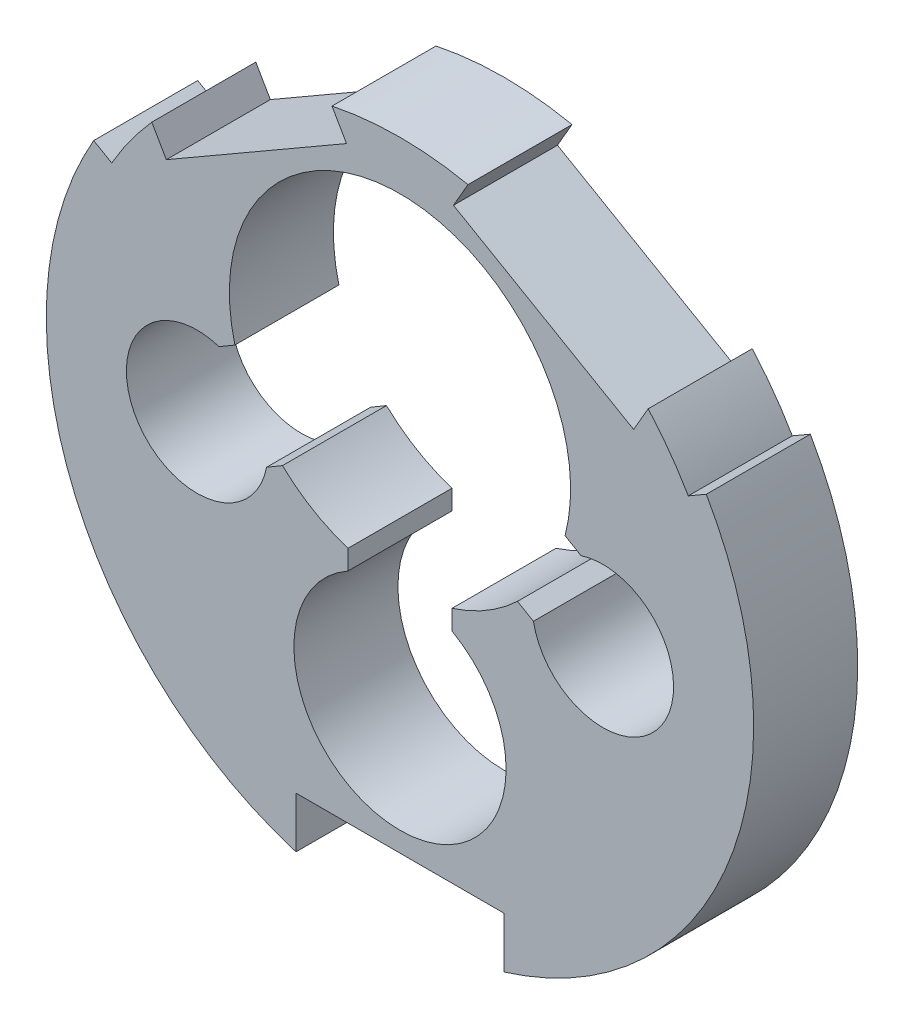
ISO-10303-21;
HEADER;
FILE_DESCRIPTION(('STEP AP214'),'2;1');
FILE_NAME('part.step','',(''),(''),'','','');
FILE_SCHEMA(('AUTOMOTIVE_DESIGN { 1 0 10303 214 1 1 1 1 }'));
ENDSEC;
DATA;
#1=APPLICATION_CONTEXT('core data for automotive mechanical design processes');
#2=APPLICATION_PROTOCOL_DEFINITION('international standard','automotive_design',2000,#1);
#3=PRODUCT_CONTEXT('',#1,'mechanical');
#4=PRODUCT('Part','Part','',(#3));
#5=PRODUCT_RELATED_PRODUCT_CATEGORY('part','',(#4));
#6=PRODUCT_DEFINITION_FORMATION('','',#4);
#7=PRODUCT_DEFINITION_CONTEXT('part definition',#1,'design');
#8=PRODUCT_DEFINITION('design','',#6,#7);
#9=PRODUCT_DEFINITION_SHAPE('','',#8);
#10=(LENGTH_UNIT() NAMED_UNIT(*) SI_UNIT(.MILLI.,.METRE.));
#11=(NAMED_UNIT(*) PLANE_ANGLE_UNIT() SI_UNIT($,.RADIAN.));
#12=(NAMED_UNIT(*) SI_UNIT($,.STERADIAN.) SOLID_ANGLE_UNIT());
#13=UNCERTAINTY_MEASURE_WITH_UNIT(LENGTH_MEASURE(1.E-05),#10,'distance_accuracy_value','');
#14=(GEOMETRIC_REPRESENTATION_CONTEXT(3) GLOBAL_UNCERTAINTY_ASSIGNED_CONTEXT((#13)) GLOBAL_UNIT_ASSIGNED_CONTEXT((#10,
#11,#12)) REPRESENTATION_CONTEXT('',''));
#15=CARTESIAN_POINT('',(0.,0.,0.));
#16=DIRECTION('',(0.,0.,1.));
#17=DIRECTION('',(1.,0.,0.));
#18=AXIS2_PLACEMENT_3D('',#15,#16,#17);
#19=CARTESIAN_POINT('',(0.,0.,2.5));
#20=DIRECTION('',(0.,0.,-1.));
#21=DIRECTION('',(-1.,0.,0.));
#22=AXIS2_PLACEMENT_3D('',#19,#20,#21);
#23=CYLINDRICAL_SURFACE('',#22,16.);
#24=DIRECTION('',(0.,0.,-1.));
#25=VECTOR('',#24,1.);
#26=CARTESIAN_POINT('',(-13.856406460551,7.99999999999997,30.0039507299882));
#27=LINE('',#26,#25);
#28=CARTESIAN_POINT('',(-13.856406460551,7.99999999999996,2.5));
#29=VERTEX_POINT('',#28);
#30=CARTESIAN_POINT('',(-13.856406460551,7.99999999999996,-2.5));
#31=VERTEX_POINT('',#30);
#32=EDGE_CURVE('E268',#29,#31,#27,.T.);
#33=ORIENTED_EDGE('',*,*,#32,.F.);
#34=CARTESIAN_POINT('',(0.,0.,2.5));
#35=DIRECTION('',(0.,0.,1.));
#36=DIRECTION('',(1.,0.,0.));
#37=AXIS2_PLACEMENT_3D('',#34,#35,#36);
#38=CIRCLE('',#37,16.);
#39=CARTESIAN_POINT('',(-11.9294690957075,10.6624465810883,2.5));
#40=VERTEX_POINT('',#39);
#41=EDGE_CURVE('E368',#40,#29,#38,.T.);
#42=ORIENTED_EDGE('',*,*,#41,.F.);
#43=DIRECTION('',(0.,0.,-1.));
#44=VECTOR('',#43,1.);
#45=CARTESIAN_POINT('',(-11.9294690957075,10.6624465810883,2.5));
#46=LINE('',#45,#44);
#47=CARTESIAN_POINT('',(-11.9294690957075,10.6624465810883,-2.5));
#48=VERTEX_POINT('',#47);
#49=EDGE_CURVE('E426',#40,#48,#46,.T.);
#50=ORIENTED_EDGE('',*,*,#49,.T.);
#51=CARTESIAN_POINT('',(0.,0.,-2.5));
#52=DIRECTION('',(0.,0.,1.));
#53=DIRECTION('',(1.,0.,0.));
#54=AXIS2_PLACEMENT_3D('',#51,#52,#53);
#55=CIRCLE('',#54,16.);
#56=EDGE_CURVE('E393',#48,#31,#55,.T.);
#57=ORIENTED_EDGE('',*,*,#56,.T.);
#58=EDGE_LOOP('',(#33,#42,#50,#57));
#59=FACE_BOUND('',#58,.T.);
#60=ADVANCED_FACE('F35',(#59),#23,.T.);
#61=CARTESIAN_POINT('',(0.,0.,2.5));
#62=DIRECTION('',(0.,0.,1.));
#63=DIRECTION('',(1.,0.,0.));
#64=AXIS2_PLACEMENT_3D('',#61,#62,#63);
#65=PLANE('',#64);
#66=CARTESIAN_POINT('',(0.,0.,2.5));
#67=DIRECTION('',(0.,0.,1.));
#68=DIRECTION('',(1.,0.,0.));
#69=AXIS2_PLACEMENT_3D('',#66,#67,#68);
#70=CIRCLE('',#69,16.);
#71=CARTESIAN_POINT('',(3.26921505786307,15.6624465810882,2.5));
#72=VERTEX_POINT('',#71);
#73=CARTESIAN_POINT('',(-3.26921505786307,15.6624465810882,2.5));
#74=VERTEX_POINT('',#73);
#75=EDGE_CURVE('E358',#72,#74,#70,.T.);
#76=ORIENTED_EDGE('',*,*,#75,.T.);
#77=DIRECTION('',(0.499999999999994,-0.866025403784442,0.));
#78=VECTOR('',#77,1.);
#79=CARTESIAN_POINT('',(-2.56987298107774,14.4511505722253,2.5));
#80=LINE('',#79,#78);
#81=CARTESIAN_POINT('',(-2.56987298107774,14.4511505722253,2.5));
#82=VERTEX_POINT('',#81);
#83=EDGE_CURVE('E361',#74,#82,#80,.T.);
#84=ORIENTED_EDGE('',*,*,#83,.T.);
#85=DIRECTION('',(-0.866025403784442,-0.499999999999995,0.));
#86=VECTOR('',#85,1.);
#87=CARTESIAN_POINT('',(-11.2301270189221,9.45115057222533,2.5));
#88=LINE('',#87,#86);
#89=CARTESIAN_POINT('',(-11.2301270189221,9.45115057222533,2.5));
#90=VERTEX_POINT('',#89);
#91=EDGE_CURVE('E364',#82,#90,#88,.T.);
#92=ORIENTED_EDGE('',*,*,#91,.T.);
#93=DIRECTION('',(-0.499999999999995,0.866025403784442,0.));
#94=VECTOR('',#93,1.);
#95=CARTESIAN_POINT('',(-11.9294690957075,10.6624465810883,2.5));
#96=LINE('',#95,#94);
#97=EDGE_CURVE('E366',#90,#40,#96,.T.);
#98=ORIENTED_EDGE('',*,*,#97,.T.);
#99=ORIENTED_EDGE('',*,*,#41,.T.);
#100=DIRECTION('',(-0.86602540378444,0.499999999999998,0.));
#101=VECTOR('',#100,1.);
#102=CARTESIAN_POINT('',(0.,0.,2.5));
#103=LINE('',#102,#101);
#104=CARTESIAN_POINT('',(-14.7224318643355,8.49999999999996,2.5));
#105=VERTEX_POINT('',#104);
#106=EDGE_CURVE('E260',#29,#105,#103,.T.);
#107=ORIENTED_EDGE('',*,*,#106,.T.);
#108=CARTESIAN_POINT('',(0.,0.,2.5));
#109=DIRECTION('',(0.,0.,1.));
#110=DIRECTION('',(1.,0.,0.));
#111=AXIS2_PLACEMENT_3D('',#108,#109,#110);
#112=CIRCLE('',#111,17.);
#113=CARTESIAN_POINT('',(-5.,-16.2480768092719,2.5));
#114=VERTEX_POINT('',#113);
#115=EDGE_CURVE('E262',#105,#114,#112,.T.);
#116=ORIENTED_EDGE('',*,*,#115,.T.);
#117=DIRECTION('',(0.,1.,0.));
#118=VECTOR('',#117,1.);
#119=CARTESIAN_POINT('',(-5.,-13.8,2.5));
#120=LINE('',#119,#118);
#121=CARTESIAN_POINT('',(-5.,-13.8,2.5));
#122=VERTEX_POINT('',#121);
#123=EDGE_CURVE('E371',#114,#122,#120,.T.);
#124=ORIENTED_EDGE('',*,*,#123,.T.);
#125=DIRECTION('',(1.,0.,0.));
#126=VECTOR('',#125,1.);
#127=CARTESIAN_POINT('',(0.,-13.8,2.5));
#128=LINE('',#127,#126);
#129=CARTESIAN_POINT('',(5.00000000000001,-13.8,2.5));
#130=VERTEX_POINT('',#129);
#131=EDGE_CURVE('E373',#122,#130,#128,.T.);
#132=ORIENTED_EDGE('',*,*,#131,.T.);
#133=DIRECTION('',(0.,-1.,0.));
#134=VECTOR('',#133,1.);
#135=CARTESIAN_POINT('',(5.00000000000001,-13.8,2.5));
#136=LINE('',#135,#134);
#137=CARTESIAN_POINT('',(5.00000000000001,-16.2480768092719,2.5));
#138=VERTEX_POINT('',#137);
#139=EDGE_CURVE('E375',#130,#138,#136,.T.);
#140=ORIENTED_EDGE('',*,*,#139,.T.);
#141=CARTESIAN_POINT('',(0.,0.,2.5));
#142=DIRECTION('',(0.,0.,1.));
#143=DIRECTION('',(1.,0.,0.));
#144=AXIS2_PLACEMENT_3D('',#141,#142,#143);
#145=CIRCLE('',#144,17.);
#146=CARTESIAN_POINT('',(14.7224318643355,8.49999999999996,2.5));
#147=VERTEX_POINT('',#146);
#148=EDGE_CURVE('E246',#138,#147,#145,.T.);
#149=ORIENTED_EDGE('',*,*,#148,.T.);
#150=DIRECTION('',(0.866025403784441,0.499999999999997,0.));
#151=VECTOR('',#150,1.);
#152=CARTESIAN_POINT('',(0.,0.,2.5));
#153=LINE('',#152,#151);
#154=CARTESIAN_POINT('',(13.856406460551,7.99999999999997,2.5));
#155=VERTEX_POINT('',#154);
#156=EDGE_CURVE('E227',#155,#147,#153,.T.);
#157=ORIENTED_EDGE('',*,*,#156,.F.);
#158=CARTESIAN_POINT('',(0.,0.,2.5));
#159=DIRECTION('',(0.,0.,1.));
#160=DIRECTION('',(1.,0.,0.));
#161=AXIS2_PLACEMENT_3D('',#158,#159,#160);
#162=CIRCLE('',#161,16.);
#163=CARTESIAN_POINT('',(11.9294690957075,10.6624465810883,2.5));
#164=VERTEX_POINT('',#163);
#165=EDGE_CURVE('E50',#155,#164,#162,.T.);
#166=ORIENTED_EDGE('',*,*,#165,.T.);
#167=DIRECTION('',(-0.499999999999997,-0.866025403784441,0.));
#168=VECTOR('',#167,1.);
#169=CARTESIAN_POINT('',(11.2301270189221,9.45115057222533,2.5));
#170=LINE('',#169,#168);
#171=CARTESIAN_POINT('',(11.2301270189221,9.45115057222533,2.5));
#172=VERTEX_POINT('',#171);
#173=EDGE_CURVE('E378',#164,#172,#170,.T.);
#174=ORIENTED_EDGE('',*,*,#173,.T.);
#175=DIRECTION('',(-0.866025403784442,0.499999999999995,0.));
#176=VECTOR('',#175,1.);
#177=CARTESIAN_POINT('',(2.56987298107774,14.4511505722253,2.5));
#178=LINE('',#177,#176);
#179=CARTESIAN_POINT('',(2.56987298107774,14.4511505722253,2.5));
#180=VERTEX_POINT('',#179);
#181=EDGE_CURVE('E380',#172,#180,#178,.T.);
#182=ORIENTED_EDGE('',*,*,#181,.T.);
#183=DIRECTION('',(0.499999999999994,0.866025403784442,0.));
#184=VECTOR('',#183,1.);
#185=CARTESIAN_POINT('',(3.26921505786307,15.6624465810882,2.5));
#186=LINE('',#185,#184);
#187=EDGE_CURVE('E382',#180,#72,#186,.T.);
#188=ORIENTED_EDGE('',*,*,#187,.T.);
#189=EDGE_LOOP('',(#76,#84,#92,#98,#99,#107,#116,#124,#132,#140,#149,#157,#166,#174,#182,#188));
#190=FACE_BOUND('',#189,.T.);
#191=DIRECTION('',(-0.861365903383803,0.507985019944294,0.));
#192=VECTOR('',#191,1.);
#193=CARTESIAN_POINT('',(8.69732788002115,2.9329369631682,2.5));
#194=LINE('',#193,#192);
#195=CARTESIAN_POINT('',(8.69732788002115,2.9329369631682,2.5));
#196=VERTEX_POINT('',#195);
#197=CARTESIAN_POINT('',(7.93506994184734,3.38247369593737,2.5));
#198=VERTEX_POINT('',#197);
#199=EDGE_CURVE('E275',#196,#198,#194,.T.);
#200=ORIENTED_EDGE('',*,*,#199,.F.);
#201=CARTESIAN_POINT('',(9.75000000000002,-0.299999999999998,2.5));
#202=DIRECTION('',(0.,0.,1.));
#203=DIRECTION('',(-1.,0.,0.));
#204=AXIS2_PLACEMENT_3D('',#201,#202,#203);
#205=CIRCLE('',#204,3.4);
#206=CARTESIAN_POINT('',(6.41139529027183,-0.943209602058916,2.5));
#207=VERTEX_POINT('',#206);
#208=EDGE_CURVE('E273',#207,#196,#205,.T.);
#209=ORIENTED_EDGE('',*,*,#208,.F.);
#210=DIRECTION('',(0.861365903383804,-0.507985019944293,0.));
#211=VECTOR('',#210,1.);
#212=CARTESIAN_POINT('',(6.41139529027183,-0.943209602058916,2.5));
#213=LINE('',#212,#211);
#214=CARTESIAN_POINT('',(5.64913735209802,-0.493672869289745,2.5));
#215=VERTEX_POINT('',#214);
#216=EDGE_CURVE('E296',#215,#207,#213,.T.);
#217=ORIENTED_EDGE('',*,*,#216,.F.);
#218=CARTESIAN_POINT('',(0.,5.45,2.5));
#219=DIRECTION('',(0.,0.,1.));
#220=DIRECTION('',(1.,0.,0.));
#221=AXIS2_PLACEMENT_3D('',#218,#219,#220);
#222=CIRCLE('',#221,8.2);
#223=CARTESIAN_POINT('',(2.5,-2.35960946526777,2.5));
#224=VERTEX_POINT('',#223);
#225=EDGE_CURVE('E294',#224,#215,#222,.T.);
#226=ORIENTED_EDGE('',*,*,#225,.F.);
#227=DIRECTION('',(0.,1.,0.));
#228=VECTOR('',#227,1.);
#229=CARTESIAN_POINT('',(2.5,-2.35960946526777,2.5));
#230=LINE('',#229,#228);
#231=CARTESIAN_POINT('',(2.5,-3.30477784582143,2.5));
#232=VERTEX_POINT('',#231);
#233=EDGE_CURVE('E292',#232,#224,#230,.T.);
#234=ORIENTED_EDGE('',*,*,#233,.F.);
#235=CARTESIAN_POINT('',(0.,-7.75,2.5));
#236=DIRECTION('',(0.,0.,1.));
#237=DIRECTION('',(1.,0.,0.));
#238=AXIS2_PLACEMENT_3D('',#235,#236,#237);
#239=CIRCLE('',#238,5.1);
#240=CARTESIAN_POINT('',(-2.5,-3.30477784582143,2.5));
#241=VERTEX_POINT('',#240);
#242=EDGE_CURVE('E290',#241,#232,#239,.T.);
#243=ORIENTED_EDGE('',*,*,#242,.F.);
#244=DIRECTION('',(0.,-1.,0.));
#245=VECTOR('',#244,1.);
#246=CARTESIAN_POINT('',(-2.5,-2.35960946526777,2.5));
#247=LINE('',#246,#245);
#248=CARTESIAN_POINT('',(-2.5,-2.35960946526777,2.5));
#249=VERTEX_POINT('',#248);
#250=EDGE_CURVE('E288',#249,#241,#247,.T.);
#251=ORIENTED_EDGE('',*,*,#250,.F.);
#252=CARTESIAN_POINT('',(0.,5.45,2.5));
#253=DIRECTION('',(0.,0.,1.));
#254=DIRECTION('',(1.,0.,0.));
#255=AXIS2_PLACEMENT_3D('',#252,#253,#254);
#256=CIRCLE('',#255,8.2);
#257=CARTESIAN_POINT('',(-5.64913735209802,-0.493672869289742,2.5));
#258=VERTEX_POINT('',#257);
#259=EDGE_CURVE('E286',#258,#249,#256,.T.);
#260=ORIENTED_EDGE('',*,*,#259,.F.);
#261=DIRECTION('',(0.861365903383803,0.507985019944293,0.));
#262=VECTOR('',#261,1.);
#263=CARTESIAN_POINT('',(-6.41139529027183,-0.943209602058917,2.5));
#264=LINE('',#263,#262);
#265=CARTESIAN_POINT('',(-6.41139529027183,-0.943209602058917,2.5));
#266=VERTEX_POINT('',#265);
#267=EDGE_CURVE('E284',#266,#258,#264,.T.);
#268=ORIENTED_EDGE('',*,*,#267,.F.);
#269=CARTESIAN_POINT('',(-9.75000000000001,-0.3,2.5));
#270=DIRECTION('',(0.,0.,1.));
#271=DIRECTION('',(1.,0.,0.));
#272=AXIS2_PLACEMENT_3D('',#269,#270,#271);
#273=CIRCLE('',#272,3.4);
#274=CARTESIAN_POINT('',(-8.69732788002115,2.9329369631682,2.5));
#275=VERTEX_POINT('',#274);
#276=EDGE_CURVE('E282',#275,#266,#273,.T.);
#277=ORIENTED_EDGE('',*,*,#276,.F.);
#278=DIRECTION('',(-0.861365903383803,-0.507985019944294,0.));
#279=VECTOR('',#278,1.);
#280=CARTESIAN_POINT('',(-8.69732788002115,2.9329369631682,2.5));
#281=LINE('',#280,#279);
#282=CARTESIAN_POINT('',(-7.93506994184734,3.38247369593737,2.5));
#283=VERTEX_POINT('',#282);
#284=EDGE_CURVE('E280',#283,#275,#281,.T.);
#285=ORIENTED_EDGE('',*,*,#284,.F.);
#286=CARTESIAN_POINT('',(0.,5.45,2.5));
#287=DIRECTION('',(0.,0.,1.));
#288=DIRECTION('',(1.,0.,0.));
#289=AXIS2_PLACEMENT_3D('',#286,#287,#288);
#290=CIRCLE('',#289,8.2);
#291=EDGE_CURVE('E278',#198,#283,#290,.T.);
#292=ORIENTED_EDGE('',*,*,#291,.F.);
#293=EDGE_LOOP('',(#200,#209,#217,#226,#234,#243,#251,#260,#268,#277,#285,#292));
#294=FACE_BOUND('',#293,.T.);
#295=ADVANCED_FACE('F449',(#190,#294),#65,.T.);
#296=CARTESIAN_POINT('',(0.,0.,-2.5));
#297=DIRECTION('',(0.,0.,1.));
#298=DIRECTION('',(1.,0.,0.));
#299=AXIS2_PLACEMENT_3D('',#296,#297,#298);
#300=PLANE('',#299);
#301=CARTESIAN_POINT('',(0.,0.,-2.5));
#302=DIRECTION('',(0.,0.,1.));
#303=DIRECTION('',(1.,0.,0.));
#304=AXIS2_PLACEMENT_3D('',#301,#302,#303);
#305=CIRCLE('',#304,16.);
#306=CARTESIAN_POINT('',(3.26921505786307,15.6624465810882,-2.5));
#307=VERTEX_POINT('',#306);
#308=CARTESIAN_POINT('',(-3.26921505786307,15.6624465810882,-2.5));
#309=VERTEX_POINT('',#308);
#310=EDGE_CURVE('E357',#307,#309,#305,.T.);
#311=ORIENTED_EDGE('',*,*,#310,.F.);
#312=DIRECTION('',(0.499999999999994,0.866025403784442,0.));
#313=VECTOR('',#312,1.);
#314=CARTESIAN_POINT('',(3.26921505786307,15.6624465810882,-2.5));
#315=LINE('',#314,#313);
#316=CARTESIAN_POINT('',(2.56987298107774,14.4511505722253,-2.5));
#317=VERTEX_POINT('',#316);
#318=EDGE_CURVE('E362',#317,#307,#315,.T.);
#319=ORIENTED_EDGE('',*,*,#318,.F.);
#320=DIRECTION('',(-0.866025403784442,0.499999999999995,0.));
#321=VECTOR('',#320,1.);
#322=CARTESIAN_POINT('',(2.56987298107774,14.4511505722253,-2.5));
#323=LINE('',#322,#321);
#324=CARTESIAN_POINT('',(11.2301270189221,9.45115057222533,-2.5));
#325=VERTEX_POINT('',#324);
#326=EDGE_CURVE('E406',#325,#317,#323,.T.);
#327=ORIENTED_EDGE('',*,*,#326,.F.);
#328=DIRECTION('',(-0.499999999999997,-0.866025403784441,0.));
#329=VECTOR('',#328,1.);
#330=CARTESIAN_POINT('',(11.2301270189221,9.45115057222533,-2.5));
#331=LINE('',#330,#329);
#332=CARTESIAN_POINT('',(11.9294690957075,10.6624465810883,-2.5));
#333=VERTEX_POINT('',#332);
#334=EDGE_CURVE('E404',#333,#325,#331,.T.);
#335=ORIENTED_EDGE('',*,*,#334,.F.);
#336=CARTESIAN_POINT('',(0.,0.,-2.5));
#337=DIRECTION('',(0.,0.,1.));
#338=DIRECTION('',(1.,0.,0.));
#339=AXIS2_PLACEMENT_3D('',#336,#337,#338);
#340=CIRCLE('',#339,16.);
#341=CARTESIAN_POINT('',(13.856406460551,7.99999999999997,-2.5));
#342=VERTEX_POINT('',#341);
#343=EDGE_CURVE('E241',#342,#333,#340,.T.);
#344=ORIENTED_EDGE('',*,*,#343,.F.);
#345=DIRECTION('',(-0.866025403784441,-0.499999999999997,0.));
#346=VECTOR('',#345,1.);
#347=CARTESIAN_POINT('',(0.,0.,-2.5));
#348=LINE('',#347,#346);
#349=CARTESIAN_POINT('',(14.7224318643355,8.49999999999996,-2.5));
#350=VERTEX_POINT('',#349);
#351=EDGE_CURVE('E226',#350,#342,#348,.T.);
#352=ORIENTED_EDGE('',*,*,#351,.F.);
#353=CARTESIAN_POINT('',(0.,0.,-2.5));
#354=DIRECTION('',(0.,0.,1.));
#355=DIRECTION('',(1.,0.,0.));
#356=AXIS2_PLACEMENT_3D('',#353,#354,#355);
#357=CIRCLE('',#356,17.);
#358=CARTESIAN_POINT('',(5.00000000000001,-16.2480768092719,-2.5));
#359=VERTEX_POINT('',#358);
#360=EDGE_CURVE('E239',#350,#359,#357,.F.);
#361=ORIENTED_EDGE('',*,*,#360,.T.);
#362=DIRECTION('',(0.,-1.,0.));
#363=VECTOR('',#362,1.);
#364=CARTESIAN_POINT('',(5.00000000000001,-13.8,-2.5));
#365=LINE('',#364,#363);
#366=CARTESIAN_POINT('',(5.00000000000001,-13.8,-2.5));
#367=VERTEX_POINT('',#366);
#368=EDGE_CURVE('E401',#367,#359,#365,.T.);
#369=ORIENTED_EDGE('',*,*,#368,.F.);
#370=DIRECTION('',(1.,0.,0.));
#371=VECTOR('',#370,1.);
#372=CARTESIAN_POINT('',(0.,-13.8,-2.5));
#373=LINE('',#372,#371);
#374=CARTESIAN_POINT('',(-5.,-13.8,-2.5));
#375=VERTEX_POINT('',#374);
#376=EDGE_CURVE('E399',#375,#367,#373,.T.);
#377=ORIENTED_EDGE('',*,*,#376,.F.);
#378=DIRECTION('',(0.,1.,0.));
#379=VECTOR('',#378,1.);
#380=CARTESIAN_POINT('',(-5.,-13.8,-2.5));
#381=LINE('',#380,#379);
#382=CARTESIAN_POINT('',(-5.,-16.2480768092719,-2.5));
#383=VERTEX_POINT('',#382);
#384=EDGE_CURVE('E396',#383,#375,#381,.T.);
#385=ORIENTED_EDGE('',*,*,#384,.F.);
#386=CARTESIAN_POINT('',(0.,0.,-2.5));
#387=DIRECTION('',(0.,0.,1.));
#388=DIRECTION('',(1.,0.,0.));
#389=AXIS2_PLACEMENT_3D('',#386,#387,#388);
#390=CIRCLE('',#389,17.);
#391=CARTESIAN_POINT('',(-14.7224318643355,8.49999999999996,-2.5));
#392=VERTEX_POINT('',#391);
#393=EDGE_CURVE('E257',#383,#392,#390,.F.);
#394=ORIENTED_EDGE('',*,*,#393,.T.);
#395=DIRECTION('',(0.86602540378444,-0.499999999999998,0.));
#396=VECTOR('',#395,1.);
#397=CARTESIAN_POINT('',(0.,0.,-2.5));
#398=LINE('',#397,#396);
#399=EDGE_CURVE('E252',#392,#31,#398,.T.);
#400=ORIENTED_EDGE('',*,*,#399,.T.);
#401=ORIENTED_EDGE('',*,*,#56,.F.);
#402=DIRECTION('',(-0.499999999999995,0.866025403784442,0.));
#403=VECTOR('',#402,1.);
#404=CARTESIAN_POINT('',(-11.9294690957075,10.6624465810883,-2.5));
#405=LINE('',#404,#403);
#406=CARTESIAN_POINT('',(-11.2301270189221,9.45115057222533,-2.5));
#407=VERTEX_POINT('',#406);
#408=EDGE_CURVE('E391',#407,#48,#405,.T.);
#409=ORIENTED_EDGE('',*,*,#408,.F.);
#410=DIRECTION('',(-0.866025403784442,-0.499999999999995,0.));
#411=VECTOR('',#410,1.);
#412=CARTESIAN_POINT('',(-11.2301270189221,9.45115057222533,-2.5));
#413=LINE('',#412,#411);
#414=CARTESIAN_POINT('',(-2.56987298107774,14.4511505722253,-2.5));
#415=VERTEX_POINT('',#414);
#416=EDGE_CURVE('E389',#415,#407,#413,.T.);
#417=ORIENTED_EDGE('',*,*,#416,.F.);
#418=DIRECTION('',(0.499999999999994,-0.866025403784442,0.));
#419=VECTOR('',#418,1.);
#420=CARTESIAN_POINT('',(-2.56987298107774,14.4511505722253,-2.5));
#421=LINE('',#420,#419);
#422=EDGE_CURVE('E387',#309,#415,#421,.T.);
#423=ORIENTED_EDGE('',*,*,#422,.F.);
#424=EDGE_LOOP('',(#311,#319,#327,#335,#344,#352,#361,#369,#377,#385,#394,#400,#401,#409,#417,#423));
#425=FACE_BOUND('',#424,.T.);
#426=CARTESIAN_POINT('',(9.75000000000002,-0.299999999999998,-2.5));
#427=DIRECTION('',(0.,0.,1.));
#428=DIRECTION('',(-1.,0.,0.));
#429=AXIS2_PLACEMENT_3D('',#426,#427,#428);
#430=CIRCLE('',#429,3.4);
#431=CARTESIAN_POINT('',(6.41139529027183,-0.943209602058916,-2.5));
#432=VERTEX_POINT('',#431);
#433=CARTESIAN_POINT('',(8.69732788002115,2.9329369631682,-2.5));
#434=VERTEX_POINT('',#433);
#435=EDGE_CURVE('E272',#432,#434,#430,.T.);
#436=ORIENTED_EDGE('',*,*,#435,.T.);
#437=DIRECTION('',(-0.861365903383803,0.507985019944294,0.));
#438=VECTOR('',#437,1.);
#439=CARTESIAN_POINT('',(8.69732788002115,2.9329369631682,-2.5));
#440=LINE('',#439,#438);
#441=CARTESIAN_POINT('',(7.93506994184734,3.38247369593737,-2.5));
#442=VERTEX_POINT('',#441);
#443=EDGE_CURVE('E301',#434,#442,#440,.T.);
#444=ORIENTED_EDGE('',*,*,#443,.T.);
#445=CARTESIAN_POINT('',(0.,5.45,-2.5));
#446=DIRECTION('',(0.,0.,1.));
#447=DIRECTION('',(1.,0.,0.));
#448=AXIS2_PLACEMENT_3D('',#445,#446,#447);
#449=CIRCLE('',#448,8.2);
#450=CARTESIAN_POINT('',(-7.93506994184734,3.38247369593737,-2.5));
#451=VERTEX_POINT('',#450);
#452=EDGE_CURVE('E304',#442,#451,#449,.T.);
#453=ORIENTED_EDGE('',*,*,#452,.T.);
#454=DIRECTION('',(-0.861365903383803,-0.507985019944294,0.));
#455=VECTOR('',#454,1.);
#456=CARTESIAN_POINT('',(-8.69732788002115,2.9329369631682,-2.5));
#457=LINE('',#456,#455);
#458=CARTESIAN_POINT('',(-8.69732788002115,2.9329369631682,-2.5));
#459=VERTEX_POINT('',#458);
#460=EDGE_CURVE('E307',#451,#459,#457,.T.);
#461=ORIENTED_EDGE('',*,*,#460,.T.);
#462=CARTESIAN_POINT('',(-9.75000000000001,-0.3,-2.5));
#463=DIRECTION('',(0.,0.,1.));
#464=DIRECTION('',(1.,0.,0.));
#465=AXIS2_PLACEMENT_3D('',#462,#463,#464);
#466=CIRCLE('',#465,3.4);
#467=CARTESIAN_POINT('',(-6.41139529027183,-0.943209602058917,-2.5));
#468=VERTEX_POINT('',#467);
#469=EDGE_CURVE('E310',#459,#468,#466,.T.);
#470=ORIENTED_EDGE('',*,*,#469,.T.);
#471=DIRECTION('',(0.861365903383803,0.507985019944293,0.));
#472=VECTOR('',#471,1.);
#473=CARTESIAN_POINT('',(-6.41139529027183,-0.943209602058917,-2.5));
#474=LINE('',#473,#472);
#475=CARTESIAN_POINT('',(-5.64913735209802,-0.493672869289742,-2.5));
#476=VERTEX_POINT('',#475);
#477=EDGE_CURVE('E313',#468,#476,#474,.T.);
#478=ORIENTED_EDGE('',*,*,#477,.T.);
#479=CARTESIAN_POINT('',(0.,5.45,-2.5));
#480=DIRECTION('',(0.,0.,1.));
#481=DIRECTION('',(1.,0.,0.));
#482=AXIS2_PLACEMENT_3D('',#479,#480,#481);
#483=CIRCLE('',#482,8.2);
#484=CARTESIAN_POINT('',(-2.5,-2.35960946526777,-2.5));
#485=VERTEX_POINT('',#484);
#486=EDGE_CURVE('E316',#476,#485,#483,.T.);
#487=ORIENTED_EDGE('',*,*,#486,.T.);
#488=DIRECTION('',(0.,-1.,0.));
#489=VECTOR('',#488,1.);
#490=CARTESIAN_POINT('',(-2.5,-2.35960946526777,-2.5));
#491=LINE('',#490,#489);
#492=CARTESIAN_POINT('',(-2.5,-3.30477784582143,-2.5));
#493=VERTEX_POINT('',#492);
#494=EDGE_CURVE('E319',#485,#493,#491,.T.);
#495=ORIENTED_EDGE('',*,*,#494,.T.);
#496=CARTESIAN_POINT('',(0.,-7.75,-2.5));
#497=DIRECTION('',(0.,0.,1.));
#498=DIRECTION('',(1.,0.,0.));
#499=AXIS2_PLACEMENT_3D('',#496,#497,#498);
#500=CIRCLE('',#499,5.1);
#501=CARTESIAN_POINT('',(2.5,-3.30477784582143,-2.5));
#502=VERTEX_POINT('',#501);
#503=EDGE_CURVE('E322',#493,#502,#500,.T.);
#504=ORIENTED_EDGE('',*,*,#503,.T.);
#505=DIRECTION('',(0.,1.,0.));
#506=VECTOR('',#505,1.);
#507=CARTESIAN_POINT('',(2.5,-2.35960946526777,-2.5));
#508=LINE('',#507,#506);
#509=CARTESIAN_POINT('',(2.5,-2.35960946526777,-2.5));
#510=VERTEX_POINT('',#509);
#511=EDGE_CURVE('E325',#502,#510,#508,.T.);
#512=ORIENTED_EDGE('',*,*,#511,.T.);
#513=CARTESIAN_POINT('',(0.,5.45,-2.5));
#514=DIRECTION('',(0.,0.,1.));
#515=DIRECTION('',(1.,0.,0.));
#516=AXIS2_PLACEMENT_3D('',#513,#514,#515);
#517=CIRCLE('',#516,8.2);
#518=CARTESIAN_POINT('',(5.64913735209802,-0.493672869289744,-2.5));
#519=VERTEX_POINT('',#518);
#520=EDGE_CURVE('E328',#510,#519,#517,.T.);
#521=ORIENTED_EDGE('',*,*,#520,.T.);
#522=DIRECTION('',(0.861365903383804,-0.507985019944293,0.));
#523=VECTOR('',#522,1.);
#524=CARTESIAN_POINT('',(6.41139529027183,-0.943209602058916,-2.5));
#525=LINE('',#524,#523);
#526=EDGE_CURVE('E276',#519,#432,#525,.T.);
#527=ORIENTED_EDGE('',*,*,#526,.T.);
#528=EDGE_LOOP('',(#436,#444,#453,#461,#470,#478,#487,#495,#504,#512,#521,#527));
#529=FACE_BOUND('',#528,.T.);
#530=ADVANCED_FACE('F236',(#425,#529),#300,.F.);
#531=CARTESIAN_POINT('',(0.,0.,2.5));
#532=DIRECTION('',(0.,0.,-1.));
#533=DIRECTION('',(-1.,0.,0.));
#534=AXIS2_PLACEMENT_3D('',#531,#532,#533);
#535=CYLINDRICAL_SURFACE('',#534,16.);
#536=ORIENTED_EDGE('',*,*,#310,.T.);
#537=DIRECTION('',(0.,0.,-1.));
#538=VECTOR('',#537,1.);
#539=CARTESIAN_POINT('',(-3.26921505786307,15.6624465810882,2.5));
#540=LINE('',#539,#538);
#541=EDGE_CURVE('E11',#74,#309,#540,.T.);
#542=ORIENTED_EDGE('',*,*,#541,.F.);
#543=ORIENTED_EDGE('',*,*,#75,.F.);
#544=DIRECTION('',(0.,0.,-1.));
#545=VECTOR('',#544,1.);
#546=CARTESIAN_POINT('',(3.26921505786307,15.6624465810882,2.5));
#547=LINE('',#546,#545);
#548=EDGE_CURVE('E384',#72,#307,#547,.T.);
#549=ORIENTED_EDGE('',*,*,#548,.T.);
#550=EDGE_LOOP('',(#536,#542,#543,#549));
#551=FACE_BOUND('',#550,.T.);
#552=ADVANCED_FACE('F37',(#551),#535,.T.);
#553=CARTESIAN_POINT('',(-2.56987298107774,14.4511505722253,2.5));
#554=DIRECTION('',(0.866025403784442,0.499999999999994,0.));
#555=DIRECTION('',(-0.499999999999994,0.866025403784442,0.));
#556=AXIS2_PLACEMENT_3D('',#553,#554,#555);
#557=PLANE('',#556);
#558=ORIENTED_EDGE('',*,*,#422,.T.);
#559=DIRECTION('',(0.,0.,-1.));
#560=VECTOR('',#559,1.);
#561=CARTESIAN_POINT('',(-2.56987298107774,14.4511505722253,2.5));
#562=LINE('',#561,#560);
#563=EDGE_CURVE('E43',#82,#415,#562,.T.);
#564=ORIENTED_EDGE('',*,*,#563,.F.);
#565=ORIENTED_EDGE('',*,*,#83,.F.);
#566=ORIENTED_EDGE('',*,*,#541,.T.);
#567=EDGE_LOOP('',(#558,#564,#565,#566));
#568=FACE_BOUND('',#567,.T.);
#569=ADVANCED_FACE('F454',(#568),#557,.F.);
#570=CARTESIAN_POINT('',(-11.2301270189221,9.45115057222533,2.5));
#571=DIRECTION('',(0.499999999999995,-0.866025403784442,0.));
#572=DIRECTION('',(0.866025403784442,0.499999999999995,0.));
#573=AXIS2_PLACEMENT_3D('',#570,#571,#572);
#574=PLANE('',#573);
#575=ORIENTED_EDGE('',*,*,#416,.T.);
#576=DIRECTION('',(0.,0.,-1.));
#577=VECTOR('',#576,1.);
#578=CARTESIAN_POINT('',(-11.2301270189221,9.45115057222533,2.5));
#579=LINE('',#578,#577);
#580=EDGE_CURVE('E429',#90,#407,#579,.T.);
#581=ORIENTED_EDGE('',*,*,#580,.F.);
#582=ORIENTED_EDGE('',*,*,#91,.F.);
#583=ORIENTED_EDGE('',*,*,#563,.T.);
#584=EDGE_LOOP('',(#575,#581,#582,#583));
#585=FACE_BOUND('',#584,.T.);
#586=ADVANCED_FACE('F436',(#585),#574,.F.);
#587=CARTESIAN_POINT('',(-11.9294690957075,10.6624465810883,2.5));
#588=DIRECTION('',(-0.866025403784441,-0.499999999999995,0.));
#589=DIRECTION('',(0.499999999999995,-0.866025403784441,0.));
#590=AXIS2_PLACEMENT_3D('',#587,#588,#589);
#591=PLANE('',#590);
#592=ORIENTED_EDGE('',*,*,#408,.T.);
#593=ORIENTED_EDGE('',*,*,#49,.F.);
#594=ORIENTED_EDGE('',*,*,#97,.F.);
#595=ORIENTED_EDGE('',*,*,#580,.T.);
#596=EDGE_LOOP('',(#592,#593,#594,#595));
#597=FACE_BOUND('',#596,.T.);
#598=ADVANCED_FACE('F443',(#597),#591,.F.);
#599=CARTESIAN_POINT('',(-5.,-13.8,2.5));
#600=DIRECTION('',(-1.,0.,0.));
#601=DIRECTION('',(0.,-1.,0.));
#602=AXIS2_PLACEMENT_3D('',#599,#600,#601);
#603=PLANE('',#602);
#604=ORIENTED_EDGE('',*,*,#384,.T.);
#605=DIRECTION('',(0.,0.,-1.));
#606=VECTOR('',#605,1.);
#607=CARTESIAN_POINT('',(-5.,-13.8,2.5));
#608=LINE('',#607,#606);
#609=EDGE_CURVE('E423',#122,#375,#608,.T.);
#610=ORIENTED_EDGE('',*,*,#609,.F.);
#611=ORIENTED_EDGE('',*,*,#123,.F.);
#612=DIRECTION('',(0.,0.,-1.));
#613=VECTOR('',#612,1.);
#614=CARTESIAN_POINT('',(-5.,-16.2480768092719,30.0039507299882));
#615=LINE('',#614,#613);
#616=EDGE_CURVE('E265',#114,#383,#615,.T.);
#617=ORIENTED_EDGE('',*,*,#616,.T.);
#618=EDGE_LOOP('',(#604,#610,#611,#617));
#619=FACE_BOUND('',#618,.T.);
#620=ADVANCED_FACE('F490',(#619),#603,.F.);
#621=CARTESIAN_POINT('',(0.,-13.8,2.5));
#622=DIRECTION('',(0.,1.,0.));
#623=DIRECTION('',(-1.,0.,0.));
#624=AXIS2_PLACEMENT_3D('',#621,#622,#623);
#625=PLANE('',#624);
#626=ORIENTED_EDGE('',*,*,#376,.T.);
#627=DIRECTION('',(0.,0.,-1.));
#628=VECTOR('',#627,1.);
#629=CARTESIAN_POINT('',(5.00000000000001,-13.8,2.5));
#630=LINE('',#629,#628);
#631=EDGE_CURVE('E420',#130,#367,#630,.T.);
#632=ORIENTED_EDGE('',*,*,#631,.F.);
#633=ORIENTED_EDGE('',*,*,#131,.F.);
#634=ORIENTED_EDGE('',*,*,#609,.T.);
#635=EDGE_LOOP('',(#626,#632,#633,#634));
#636=FACE_BOUND('',#635,.T.);
#637=ADVANCED_FACE('F479',(#636),#625,.F.);
#638=CARTESIAN_POINT('',(5.00000000000001,-13.8,2.5));
#639=DIRECTION('',(1.,0.,0.));
#640=DIRECTION('',(0.,1.,0.));
#641=AXIS2_PLACEMENT_3D('',#638,#639,#640);
#642=PLANE('',#641);
#643=ORIENTED_EDGE('',*,*,#368,.T.);
#644=DIRECTION('',(0.,0.,-1.));
#645=VECTOR('',#644,1.);
#646=CARTESIAN_POINT('',(5.00000000000001,-16.2480768092719,30.0039507299882));
#647=LINE('',#646,#645);
#648=EDGE_CURVE('E231',#138,#359,#647,.T.);
#649=ORIENTED_EDGE('',*,*,#648,.F.);
#650=ORIENTED_EDGE('',*,*,#139,.F.);
#651=ORIENTED_EDGE('',*,*,#631,.T.);
#652=EDGE_LOOP('',(#643,#649,#650,#651));
#653=FACE_BOUND('',#652,.T.);
#654=ADVANCED_FACE('F472',(#653),#642,.F.);
#655=CARTESIAN_POINT('',(0.,0.,2.5));
#656=DIRECTION('',(0.,0.,-1.));
#657=DIRECTION('',(-1.,0.,0.));
#658=AXIS2_PLACEMENT_3D('',#655,#656,#657);
#659=CYLINDRICAL_SURFACE('',#658,16.);
#660=ORIENTED_EDGE('',*,*,#165,.F.);
#661=DIRECTION('',(0.,0.,-1.));
#662=VECTOR('',#661,1.);
#663=CARTESIAN_POINT('',(13.856406460551,7.99999999999997,30.0039507299882));
#664=LINE('',#663,#662);
#665=EDGE_CURVE('E248',#155,#342,#664,.T.);
#666=ORIENTED_EDGE('',*,*,#665,.T.);
#667=ORIENTED_EDGE('',*,*,#343,.T.);
#668=DIRECTION('',(0.,0.,-1.));
#669=VECTOR('',#668,1.);
#670=CARTESIAN_POINT('',(11.9294690957075,10.6624465810883,2.5));
#671=LINE('',#670,#669);
#672=EDGE_CURVE('E417',#164,#333,#671,.T.);
#673=ORIENTED_EDGE('',*,*,#672,.F.);
#674=EDGE_LOOP('',(#660,#666,#667,#673));
#675=FACE_BOUND('',#674,.T.);
#676=ADVANCED_FACE('F470',(#675),#659,.T.);
#677=CARTESIAN_POINT('',(11.2301270189221,9.45115057222533,2.5));
#678=DIRECTION('',(0.866025403784441,-0.499999999999997,0.));
#679=DIRECTION('',(0.499999999999997,0.866025403784441,0.));
#680=AXIS2_PLACEMENT_3D('',#677,#678,#679);
#681=PLANE('',#680);
#682=ORIENTED_EDGE('',*,*,#334,.T.);
#683=DIRECTION('',(0.,0.,-1.));
#684=VECTOR('',#683,1.);
#685=CARTESIAN_POINT('',(11.2301270189221,9.45115057222533,2.5));
#686=LINE('',#685,#684);
#687=EDGE_CURVE('E414',#172,#325,#686,.T.);
#688=ORIENTED_EDGE('',*,*,#687,.F.);
#689=ORIENTED_EDGE('',*,*,#173,.F.);
#690=ORIENTED_EDGE('',*,*,#672,.T.);
#691=EDGE_LOOP('',(#682,#688,#689,#690));
#692=FACE_BOUND('',#691,.T.);
#693=ADVANCED_FACE('F469',(#692),#681,.F.);
#694=CARTESIAN_POINT('',(2.56987298107774,14.4511505722253,2.5));
#695=DIRECTION('',(-0.499999999999995,-0.866025403784442,0.));
#696=DIRECTION('',(0.866025403784442,-0.499999999999995,0.));
#697=AXIS2_PLACEMENT_3D('',#694,#695,#696);
#698=PLANE('',#697);
#699=ORIENTED_EDGE('',*,*,#326,.T.);
#700=DIRECTION('',(0.,0.,-1.));
#701=VECTOR('',#700,1.);
#702=CARTESIAN_POINT('',(2.56987298107774,14.4511505722253,2.5));
#703=LINE('',#702,#701);
#704=EDGE_CURVE('E411',#180,#317,#703,.T.);
#705=ORIENTED_EDGE('',*,*,#704,.F.);
#706=ORIENTED_EDGE('',*,*,#181,.F.);
#707=ORIENTED_EDGE('',*,*,#687,.T.);
#708=EDGE_LOOP('',(#699,#705,#706,#707));
#709=FACE_BOUND('',#708,.T.);
#710=ADVANCED_FACE('F465',(#709),#698,.F.);
#711=CARTESIAN_POINT('',(3.26921505786307,15.6624465810882,2.5));
#712=DIRECTION('',(-0.866025403784442,0.499999999999994,0.));
#713=DIRECTION('',(-0.499999999999994,-0.866025403784442,0.));
#714=AXIS2_PLACEMENT_3D('',#711,#712,#713);
#715=PLANE('',#714);
#716=ORIENTED_EDGE('',*,*,#318,.T.);
#717=ORIENTED_EDGE('',*,*,#548,.F.);
#718=ORIENTED_EDGE('',*,*,#187,.F.);
#719=ORIENTED_EDGE('',*,*,#704,.T.);
#720=EDGE_LOOP('',(#716,#717,#718,#719));
#721=FACE_BOUND('',#720,.T.);
#722=ADVANCED_FACE('F460',(#721),#715,.F.);
#723=CARTESIAN_POINT('',(9.75000000000002,-0.299999999999998,2.5));
#724=DIRECTION('',(0.,0.,-1.));
#725=DIRECTION('',(-1.,0.,0.));
#726=AXIS2_PLACEMENT_3D('',#723,#724,#725);
#727=CYLINDRICAL_SURFACE('',#726,3.4);
#728=ORIENTED_EDGE('',*,*,#435,.F.);
#729=DIRECTION('',(0.,0.,-1.));
#730=VECTOR('',#729,1.);
#731=CARTESIAN_POINT('',(6.41139529027183,-0.943209602058916,2.5));
#732=LINE('',#731,#730);
#733=EDGE_CURVE('E298',#207,#432,#732,.T.);
#734=ORIENTED_EDGE('',*,*,#733,.F.);
#735=ORIENTED_EDGE('',*,*,#208,.T.);
#736=DIRECTION('',(0.,0.,-1.));
#737=VECTOR('',#736,1.);
#738=CARTESIAN_POINT('',(8.69732788002115,2.9329369631682,2.5));
#739=LINE('',#738,#737);
#740=EDGE_CURVE('E354',#196,#434,#739,.T.);
#741=ORIENTED_EDGE('',*,*,#740,.T.);
#742=EDGE_LOOP('',(#728,#734,#735,#741));
#743=FACE_BOUND('',#742,.T.);
#744=ADVANCED_FACE('F509',(#743),#727,.F.);
#745=CARTESIAN_POINT('',(8.69732788002115,2.9329369631682,2.5));
#746=DIRECTION('',(-0.507985019944294,-0.861365903383803,0.));
#747=DIRECTION('',(0.861365903383803,-0.507985019944294,0.));
#748=AXIS2_PLACEMENT_3D('',#745,#746,#747);
#749=PLANE('',#748);
#750=ORIENTED_EDGE('',*,*,#443,.F.);
#751=ORIENTED_EDGE('',*,*,#740,.F.);
#752=ORIENTED_EDGE('',*,*,#199,.T.);
#753=DIRECTION('',(0.,0.,-1.));
#754=VECTOR('',#753,1.);
#755=CARTESIAN_POINT('',(7.93506994184734,3.38247369593737,2.5));
#756=LINE('',#755,#754);
#757=EDGE_CURVE('E352',#198,#442,#756,.T.);
#758=ORIENTED_EDGE('',*,*,#757,.T.);
#759=EDGE_LOOP('',(#750,#751,#752,#758));
#760=FACE_BOUND('',#759,.T.);
#761=ADVANCED_FACE('F525',(#760),#749,.T.);
#762=CARTESIAN_POINT('',(0.,5.45,2.5));
#763=DIRECTION('',(0.,0.,-1.));
#764=DIRECTION('',(-1.,0.,0.));
#765=AXIS2_PLACEMENT_3D('',#762,#763,#764);
#766=CYLINDRICAL_SURFACE('',#765,8.2);
#767=ORIENTED_EDGE('',*,*,#452,.F.);
#768=ORIENTED_EDGE('',*,*,#757,.F.);
#769=ORIENTED_EDGE('',*,*,#291,.T.);
#770=DIRECTION('',(0.,0.,-1.));
#771=VECTOR('',#770,1.);
#772=CARTESIAN_POINT('',(-7.93506994184734,3.38247369593737,2.5));
#773=LINE('',#772,#771);
#774=EDGE_CURVE('E350',#283,#451,#773,.T.);
#775=ORIENTED_EDGE('',*,*,#774,.T.);
#776=EDGE_LOOP('',(#767,#768,#769,#775));
#777=FACE_BOUND('',#776,.T.);
#778=ADVANCED_FACE('F532',(#777),#766,.F.);
#779=CARTESIAN_POINT('',(-8.69732788002115,2.9329369631682,2.5));
#780=DIRECTION('',(0.507985019944294,-0.861365903383803,0.));
#781=DIRECTION('',(0.861365903383803,0.507985019944294,0.));
#782=AXIS2_PLACEMENT_3D('',#779,#780,#781);
#783=PLANE('',#782);
#784=ORIENTED_EDGE('',*,*,#460,.F.);
#785=ORIENTED_EDGE('',*,*,#774,.F.);
#786=ORIENTED_EDGE('',*,*,#284,.T.);
#787=DIRECTION('',(0.,0.,-1.));
#788=VECTOR('',#787,1.);
#789=CARTESIAN_POINT('',(-8.69732788002115,2.9329369631682,2.5));
#790=LINE('',#789,#788);
#791=EDGE_CURVE('E348',#275,#459,#790,.T.);
#792=ORIENTED_EDGE('',*,*,#791,.T.);
#793=EDGE_LOOP('',(#784,#785,#786,#792));
#794=FACE_BOUND('',#793,.T.);
#795=ADVANCED_FACE('F540',(#794),#783,.T.);
#796=CARTESIAN_POINT('',(-9.75000000000001,-0.3,2.5));
#797=DIRECTION('',(0.,0.,-1.));
#798=DIRECTION('',(-1.,0.,0.));
#799=AXIS2_PLACEMENT_3D('',#796,#797,#798);
#800=CYLINDRICAL_SURFACE('',#799,3.4);
#801=ORIENTED_EDGE('',*,*,#469,.F.);
#802=ORIENTED_EDGE('',*,*,#791,.F.);
#803=ORIENTED_EDGE('',*,*,#276,.T.);
#804=DIRECTION('',(0.,0.,-1.));
#805=VECTOR('',#804,1.);
#806=CARTESIAN_POINT('',(-6.41139529027183,-0.943209602058917,2.5));
#807=LINE('',#806,#805);
#808=EDGE_CURVE('E346',#266,#468,#807,.T.);
#809=ORIENTED_EDGE('',*,*,#808,.T.);
#810=EDGE_LOOP('',(#801,#802,#803,#809));
#811=FACE_BOUND('',#810,.T.);
#812=ADVANCED_FACE('F548',(#811),#800,.F.);
#813=CARTESIAN_POINT('',(-6.41139529027183,-0.943209602058917,2.5));
#814=DIRECTION('',(-0.507985019944293,0.861365903383804,0.));
#815=DIRECTION('',(-0.861365903383804,-0.507985019944293,0.));
#816=AXIS2_PLACEMENT_3D('',#813,#814,#815);
#817=PLANE('',#816);
#818=ORIENTED_EDGE('',*,*,#477,.F.);
#819=ORIENTED_EDGE('',*,*,#808,.F.);
#820=ORIENTED_EDGE('',*,*,#267,.T.);
#821=DIRECTION('',(0.,0.,-1.));
#822=VECTOR('',#821,1.);
#823=CARTESIAN_POINT('',(-5.64913735209802,-0.493672869289742,2.5));
#824=LINE('',#823,#822);
#825=EDGE_CURVE('E344',#258,#476,#824,.T.);
#826=ORIENTED_EDGE('',*,*,#825,.T.);
#827=EDGE_LOOP('',(#818,#819,#820,#826));
#828=FACE_BOUND('',#827,.T.);
#829=ADVANCED_FACE('F556',(#828),#817,.T.);
#830=CARTESIAN_POINT('',(0.,5.45,2.5));
#831=DIRECTION('',(0.,0.,-1.));
#832=DIRECTION('',(-1.,0.,0.));
#833=AXIS2_PLACEMENT_3D('',#830,#831,#832);
#834=CYLINDRICAL_SURFACE('',#833,8.2);
#835=ORIENTED_EDGE('',*,*,#486,.F.);
#836=ORIENTED_EDGE('',*,*,#825,.F.);
#837=ORIENTED_EDGE('',*,*,#259,.T.);
#838=DIRECTION('',(0.,0.,-1.));
#839=VECTOR('',#838,1.);
#840=CARTESIAN_POINT('',(-2.5,-2.35960946526777,2.5));
#841=LINE('',#840,#839);
#842=EDGE_CURVE('E342',#249,#485,#841,.T.);
#843=ORIENTED_EDGE('',*,*,#842,.T.);
#844=EDGE_LOOP('',(#835,#836,#837,#843));
#845=FACE_BOUND('',#844,.T.);
#846=ADVANCED_FACE('F564',(#845),#834,.F.);
#847=CARTESIAN_POINT('',(-2.5,-2.35960946526777,2.5));
#848=DIRECTION('',(1.,0.,0.));
#849=DIRECTION('',(0.,0.,-1.));
#850=AXIS2_PLACEMENT_3D('',#847,#848,#849);
#851=PLANE('',#850);
#852=ORIENTED_EDGE('',*,*,#494,.F.);
#853=ORIENTED_EDGE('',*,*,#842,.F.);
#854=ORIENTED_EDGE('',*,*,#250,.T.);
#855=DIRECTION('',(0.,0.,-1.));
#856=VECTOR('',#855,1.);
#857=CARTESIAN_POINT('',(-2.5,-3.30477784582143,2.5));
#858=LINE('',#857,#856);
#859=EDGE_CURVE('E340',#241,#493,#858,.T.);
#860=ORIENTED_EDGE('',*,*,#859,.T.);
#861=EDGE_LOOP('',(#852,#853,#854,#860));
#862=FACE_BOUND('',#861,.T.);
#863=ADVANCED_FACE('F572',(#862),#851,.T.);
#864=CARTESIAN_POINT('',(0.,-7.75,2.5));
#865=DIRECTION('',(0.,0.,-1.));
#866=DIRECTION('',(-1.,0.,0.));
#867=AXIS2_PLACEMENT_3D('',#864,#865,#866);
#868=CYLINDRICAL_SURFACE('',#867,5.1);
#869=ORIENTED_EDGE('',*,*,#503,.F.);
#870=ORIENTED_EDGE('',*,*,#859,.F.);
#871=ORIENTED_EDGE('',*,*,#242,.T.);
#872=DIRECTION('',(0.,0.,-1.));
#873=VECTOR('',#872,1.);
#874=CARTESIAN_POINT('',(2.5,-3.30477784582143,2.5));
#875=LINE('',#874,#873);
#876=EDGE_CURVE('E338',#232,#502,#875,.T.);
#877=ORIENTED_EDGE('',*,*,#876,.T.);
#878=EDGE_LOOP('',(#869,#870,#871,#877));
#879=FACE_BOUND('',#878,.T.);
#880=ADVANCED_FACE('F580',(#879),#868,.F.);
#881=CARTESIAN_POINT('',(2.5,-2.35960946526777,2.5));
#882=DIRECTION('',(-1.,0.,0.));
#883=DIRECTION('',(0.,0.,1.));
#884=AXIS2_PLACEMENT_3D('',#881,#882,#883);
#885=PLANE('',#884);
#886=ORIENTED_EDGE('',*,*,#511,.F.);
#887=ORIENTED_EDGE('',*,*,#876,.F.);
#888=ORIENTED_EDGE('',*,*,#233,.T.);
#889=DIRECTION('',(0.,0.,-1.));
#890=VECTOR('',#889,1.);
#891=CARTESIAN_POINT('',(2.5,-2.35960946526777,2.5));
#892=LINE('',#891,#890);
#893=EDGE_CURVE('E336',#224,#510,#892,.T.);
#894=ORIENTED_EDGE('',*,*,#893,.T.);
#895=EDGE_LOOP('',(#886,#887,#888,#894));
#896=FACE_BOUND('',#895,.T.);
#897=ADVANCED_FACE('F588',(#896),#885,.T.);
#898=CARTESIAN_POINT('',(0.,5.45,2.5));
#899=DIRECTION('',(0.,0.,-1.));
#900=DIRECTION('',(-1.,0.,0.));
#901=AXIS2_PLACEMENT_3D('',#898,#899,#900);
#902=CYLINDRICAL_SURFACE('',#901,8.2);
#903=ORIENTED_EDGE('',*,*,#520,.F.);
#904=ORIENTED_EDGE('',*,*,#893,.F.);
#905=ORIENTED_EDGE('',*,*,#225,.T.);
#906=DIRECTION('',(0.,0.,-1.));
#907=VECTOR('',#906,1.);
#908=CARTESIAN_POINT('',(5.64913735209802,-0.493672869289744,2.5));
#909=LINE('',#908,#907);
#910=EDGE_CURVE('E58',#215,#519,#909,.T.);
#911=ORIENTED_EDGE('',*,*,#910,.T.);
#912=EDGE_LOOP('',(#903,#904,#905,#911));
#913=FACE_BOUND('',#912,.T.);
#914=ADVANCED_FACE('F596',(#913),#902,.F.);
#915=CARTESIAN_POINT('',(6.41139529027183,-0.943209602058916,2.5));
#916=DIRECTION('',(0.507985019944293,0.861365903383804,0.));
#917=DIRECTION('',(-0.861365903383804,0.507985019944293,0.));
#918=AXIS2_PLACEMENT_3D('',#915,#916,#917);
#919=PLANE('',#918);
#920=ORIENTED_EDGE('',*,*,#526,.F.);
#921=ORIENTED_EDGE('',*,*,#910,.F.);
#922=ORIENTED_EDGE('',*,*,#216,.T.);
#923=ORIENTED_EDGE('',*,*,#733,.T.);
#924=EDGE_LOOP('',(#920,#921,#922,#923));
#925=FACE_BOUND('',#924,.T.);
#926=ADVANCED_FACE('F604',(#925),#919,.T.);
#927=CARTESIAN_POINT('',(0.,0.,30.0039507299882));
#928=DIRECTION('',(0.,0.,-1.));
#929=DIRECTION('',(-1.,0.,0.));
#930=AXIS2_PLACEMENT_3D('',#927,#928,#929);
#931=CYLINDRICAL_SURFACE('',#930,17.);
#932=ORIENTED_EDGE('',*,*,#115,.F.);
#933=DIRECTION('',(0.,0.,-1.));
#934=VECTOR('',#933,1.);
#935=CARTESIAN_POINT('',(-14.7224318643355,8.49999999999996,30.0039507299882));
#936=LINE('',#935,#934);
#937=EDGE_CURVE('E266',#105,#392,#936,.T.);
#938=ORIENTED_EDGE('',*,*,#937,.T.);
#939=ORIENTED_EDGE('',*,*,#393,.F.);
#940=ORIENTED_EDGE('',*,*,#616,.F.);
#941=EDGE_LOOP('',(#932,#938,#939,#940));
#942=FACE_BOUND('',#941,.T.);
#943=ADVANCED_FACE('F612',(#942),#931,.T.);
#944=CARTESIAN_POINT('',(0.,0.,30.0039507299882));
#945=DIRECTION('',(-0.499999999999997,-0.86602540378444,0.));
#946=DIRECTION('',(0.86602540378444,-0.499999999999998,0.));
#947=AXIS2_PLACEMENT_3D('',#944,#945,#946);
#948=PLANE('',#947);
#949=ORIENTED_EDGE('',*,*,#106,.F.);
#950=ORIENTED_EDGE('',*,*,#32,.T.);
#951=ORIENTED_EDGE('',*,*,#399,.F.);
#952=ORIENTED_EDGE('',*,*,#937,.F.);
#953=EDGE_LOOP('',(#949,#950,#951,#952));
#954=FACE_BOUND('',#953,.T.);
#955=ADVANCED_FACE('F619',(#954),#948,.F.);
#956=CARTESIAN_POINT('',(0.,0.,30.0039507299882));
#957=DIRECTION('',(-0.499999999999997,0.866025403784441,0.));
#958=DIRECTION('',(-0.866025403784441,-0.499999999999997,0.));
#959=AXIS2_PLACEMENT_3D('',#956,#957,#958);
#960=PLANE('',#959);
#961=ORIENTED_EDGE('',*,*,#665,.F.);
#962=ORIENTED_EDGE('',*,*,#156,.T.);
#963=DIRECTION('',(0.,0.,-1.));
#964=VECTOR('',#963,1.);
#965=CARTESIAN_POINT('',(14.7224318643355,8.49999999999996,30.0039507299882));
#966=LINE('',#965,#964);
#967=EDGE_CURVE('E222',#147,#350,#966,.T.);
#968=ORIENTED_EDGE('',*,*,#967,.T.);
#969=ORIENTED_EDGE('',*,*,#351,.T.);
#970=EDGE_LOOP('',(#961,#962,#968,#969));
#971=FACE_BOUND('',#970,.T.);
#972=ADVANCED_FACE('F225',(#971),#960,.T.);
#973=CARTESIAN_POINT('',(0.,0.,30.0039507299882));
#974=DIRECTION('',(0.,0.,-1.));
#975=DIRECTION('',(-1.,0.,0.));
#976=AXIS2_PLACEMENT_3D('',#973,#974,#975);
#977=CYLINDRICAL_SURFACE('',#976,17.);
#978=ORIENTED_EDGE('',*,*,#148,.F.);
#979=ORIENTED_EDGE('',*,*,#648,.T.);
#980=ORIENTED_EDGE('',*,*,#360,.F.);
#981=ORIENTED_EDGE('',*,*,#967,.F.);
#982=EDGE_LOOP('',(#978,#979,#980,#981));
#983=FACE_BOUND('',#982,.T.);
#984=ADVANCED_FACE('F244',(#983),#977,.T.);
#985=CLOSED_SHELL('',(#60,#295,#530,#552,#569,#586,#598,#620,#637,#654,#676,#693,#710,#722,#744,
#761,#778,#795,#812,#829,#846,#863,#880,#897,#914,#926,#943,#955,#972,#984));
#986=MANIFOLD_SOLID_BREP('B2',#985);
#987=ADVANCED_BREP_SHAPE_REPRESENTATION('',(#18,#986),#14);
#988=SHAPE_DEFINITION_REPRESENTATION(#9,#987);
ENDSEC;
END-ISO-10303-21;
